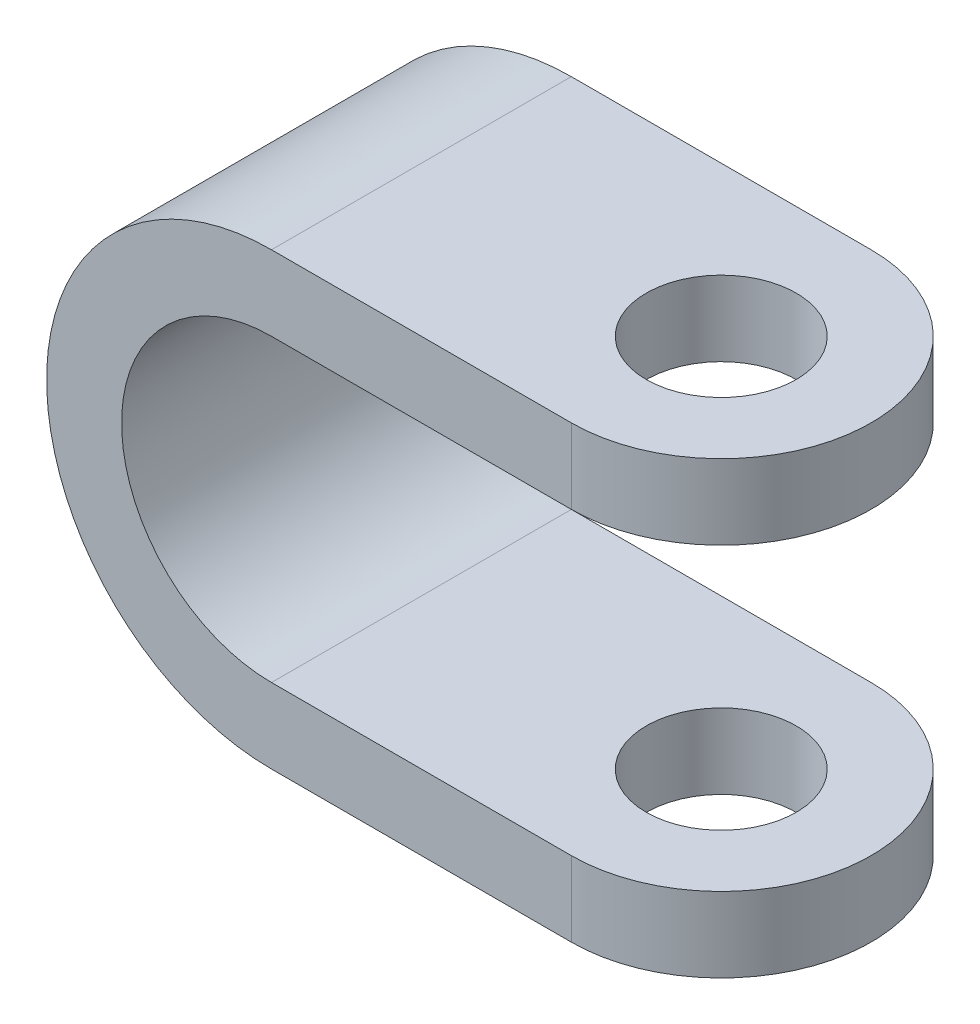
ISO-10303-21;
HEADER;
FILE_DESCRIPTION(('STEP AP214'),'2;1');
FILE_NAME('part.step','',(''),(''),'','','');
FILE_SCHEMA(('AUTOMOTIVE_DESIGN { 1 0 10303 214 1 1 1 1 }'));
ENDSEC;
DATA;
#1=APPLICATION_CONTEXT('core data for automotive mechanical design processes');
#2=APPLICATION_PROTOCOL_DEFINITION('international standard','automotive_design',2000,#1);
#3=PRODUCT_CONTEXT('',#1,'mechanical');
#4=PRODUCT('Part','Part','',(#3));
#5=PRODUCT_RELATED_PRODUCT_CATEGORY('part','',(#4));
#6=PRODUCT_DEFINITION_FORMATION('','',#4);
#7=PRODUCT_DEFINITION_CONTEXT('part definition',#1,'design');
#8=PRODUCT_DEFINITION('design','',#6,#7);
#9=PRODUCT_DEFINITION_SHAPE('','',#8);
#10=(LENGTH_UNIT() NAMED_UNIT(*) SI_UNIT(.MILLI.,.METRE.));
#11=(NAMED_UNIT(*) PLANE_ANGLE_UNIT() SI_UNIT($,.RADIAN.));
#12=(NAMED_UNIT(*) SI_UNIT($,.STERADIAN.) SOLID_ANGLE_UNIT());
#13=UNCERTAINTY_MEASURE_WITH_UNIT(LENGTH_MEASURE(1.E-05),#10,'distance_accuracy_value','');
#14=(GEOMETRIC_REPRESENTATION_CONTEXT(3) GLOBAL_UNCERTAINTY_ASSIGNED_CONTEXT((#13)) GLOBAL_UNIT_ASSIGNED_CONTEXT((#10,
#11,#12)) REPRESENTATION_CONTEXT('',''));
#15=CARTESIAN_POINT('',(0.,0.,0.));
#16=DIRECTION('',(0.,0.,1.));
#17=DIRECTION('',(1.,0.,0.));
#18=AXIS2_PLACEMENT_3D('',#15,#16,#17);
#19=CARTESIAN_POINT('',(-90.,-90.,65.));
#20=DIRECTION('',(0.,0.,1.));
#21=DIRECTION('',(1.,0.,0.));
#22=AXIS2_PLACEMENT_3D('',#19,#20,#21);
#23=PLANE('',#22);
#24=DIRECTION('',(1.,0.,0.));
#25=VECTOR('',#24,1.);
#26=CARTESIAN_POINT('',(-60.,-55.,65.));
#27=LINE('',#26,#25);
#28=CARTESIAN_POINT('',(-60.,-55.,65.));
#29=VERTEX_POINT('',#28);
#30=CARTESIAN_POINT('',(-20.,-55.,65.));
#31=VERTEX_POINT('',#30);
#32=EDGE_CURVE('E120',#29,#31,#27,.T.);
#33=ORIENTED_EDGE('',*,*,#32,.F.);
#34=CARTESIAN_POINT('',(-60.,-35.,65.));
#35=DIRECTION('',(0.,0.,1.));
#36=DIRECTION('',(1.,0.,0.));
#37=AXIS2_PLACEMENT_3D('',#34,#35,#36);
#38=CIRCLE('',#37,20.);
#39=CARTESIAN_POINT('',(-60.,-15.,65.));
#40=VERTEX_POINT('',#39);
#41=EDGE_CURVE('E133',#40,#29,#38,.T.);
#42=ORIENTED_EDGE('',*,*,#41,.F.);
#43=DIRECTION('',(-1.,0.,0.));
#44=VECTOR('',#43,1.);
#45=CARTESIAN_POINT('',(0.,-15.,65.));
#46=LINE('',#45,#44);
#47=CARTESIAN_POINT('',(-20.,-15.,65.));
#48=VERTEX_POINT('',#47);
#49=EDGE_CURVE('E140',#48,#40,#46,.T.);
#50=ORIENTED_EDGE('',*,*,#49,.F.);
#51=DIRECTION('',(0.,1.,0.));
#52=VECTOR('',#51,1.);
#53=CARTESIAN_POINT('',(-20.,-90.,65.));
#54=LINE('',#53,#52);
#55=CARTESIAN_POINT('',(-20.,-5.,65.));
#56=VERTEX_POINT('',#55);
#57=EDGE_CURVE('E125',#48,#56,#54,.T.);
#58=ORIENTED_EDGE('',*,*,#57,.T.);
#59=DIRECTION('',(-1.,0.,0.));
#60=VECTOR('',#59,1.);
#61=CARTESIAN_POINT('',(0.,-5.,65.));
#62=LINE('',#61,#60);
#63=CARTESIAN_POINT('',(-60.,-5.,65.));
#64=VERTEX_POINT('',#63);
#65=EDGE_CURVE('E243',#56,#64,#62,.T.);
#66=ORIENTED_EDGE('',*,*,#65,.T.);
#67=CARTESIAN_POINT('',(-60.,-35.,65.));
#68=DIRECTION('',(0.,0.,1.));
#69=DIRECTION('',(1.,0.,0.));
#70=AXIS2_PLACEMENT_3D('',#67,#68,#69);
#71=CIRCLE('',#70,30.);
#72=CARTESIAN_POINT('',(-60.,-65.,65.));
#73=VERTEX_POINT('',#72);
#74=EDGE_CURVE('E184',#64,#73,#71,.T.);
#75=ORIENTED_EDGE('',*,*,#74,.T.);
#76=DIRECTION('',(1.,0.,0.));
#77=VECTOR('',#76,1.);
#78=CARTESIAN_POINT('',(-60.,-65.,65.));
#79=LINE('',#78,#77);
#80=CARTESIAN_POINT('',(-20.,-65.,65.));
#81=VERTEX_POINT('',#80);
#82=EDGE_CURVE('E122',#73,#81,#79,.T.);
#83=ORIENTED_EDGE('',*,*,#82,.T.);
#84=EDGE_CURVE('E109',#81,#31,#54,.T.);
#85=ORIENTED_EDGE('',*,*,#84,.T.);
#86=EDGE_LOOP('',(#33,#42,#50,#58,#66,#75,#83,#85));
#87=FACE_BOUND('',#86,.T.);
#88=ADVANCED_FACE('F41',(#87),#23,.T.);
#89=CARTESIAN_POINT('',(-90.,-90.,25.));
#90=DIRECTION('',(0.,0.,-1.));
#91=DIRECTION('',(-1.,0.,0.));
#92=AXIS2_PLACEMENT_3D('',#89,#90,#91);
#93=PLANE('',#92);
#94=DIRECTION('',(-1.,0.,0.));
#95=VECTOR('',#94,1.);
#96=CARTESIAN_POINT('',(-60.,-55.,25.));
#97=LINE('',#96,#95);
#98=CARTESIAN_POINT('',(-20.,-55.,25.));
#99=VERTEX_POINT('',#98);
#100=CARTESIAN_POINT('',(-60.,-55.,25.));
#101=VERTEX_POINT('',#100);
#102=EDGE_CURVE('E155',#99,#101,#97,.T.);
#103=ORIENTED_EDGE('',*,*,#102,.F.);
#104=DIRECTION('',(0.,1.,0.));
#105=VECTOR('',#104,1.);
#106=CARTESIAN_POINT('',(-20.,-90.,25.));
#107=LINE('',#106,#105);
#108=CARTESIAN_POINT('',(-20.,-65.,25.));
#109=VERTEX_POINT('',#108);
#110=EDGE_CURVE('E111',#109,#99,#107,.T.);
#111=ORIENTED_EDGE('',*,*,#110,.F.);
#112=DIRECTION('',(-1.,0.,0.));
#113=VECTOR('',#112,1.);
#114=CARTESIAN_POINT('',(-60.,-65.,25.));
#115=LINE('',#114,#113);
#116=CARTESIAN_POINT('',(-60.,-65.,25.));
#117=VERTEX_POINT('',#116);
#118=EDGE_CURVE('E138',#109,#117,#115,.T.);
#119=ORIENTED_EDGE('',*,*,#118,.T.);
#120=CARTESIAN_POINT('',(-60.,-35.,25.));
#121=DIRECTION('',(0.,0.,-1.));
#122=DIRECTION('',(-1.,0.,0.));
#123=AXIS2_PLACEMENT_3D('',#120,#121,#122);
#124=CIRCLE('',#123,30.);
#125=CARTESIAN_POINT('',(-60.,-5.,25.));
#126=VERTEX_POINT('',#125);
#127=EDGE_CURVE('E187',#117,#126,#124,.T.);
#128=ORIENTED_EDGE('',*,*,#127,.T.);
#129=DIRECTION('',(1.,0.,0.));
#130=VECTOR('',#129,1.);
#131=CARTESIAN_POINT('',(0.,-5.,25.));
#132=LINE('',#131,#130);
#133=CARTESIAN_POINT('',(-20.,-5.00000000000002,25.));
#134=VERTEX_POINT('',#133);
#135=EDGE_CURVE('E132',#126,#134,#132,.T.);
#136=ORIENTED_EDGE('',*,*,#135,.T.);
#137=CARTESIAN_POINT('',(-20.,-15.,25.));
#138=VERTEX_POINT('',#137);
#139=EDGE_CURVE('E124',#138,#134,#107,.T.);
#140=ORIENTED_EDGE('',*,*,#139,.F.);
#141=DIRECTION('',(1.,0.,0.));
#142=VECTOR('',#141,1.);
#143=CARTESIAN_POINT('',(0.,-15.,25.));
#144=LINE('',#143,#142);
#145=CARTESIAN_POINT('',(-60.,-15.,25.));
#146=VERTEX_POINT('',#145);
#147=EDGE_CURVE('E147',#146,#138,#144,.T.);
#148=ORIENTED_EDGE('',*,*,#147,.F.);
#149=CARTESIAN_POINT('',(-60.,-35.,25.));
#150=DIRECTION('',(0.,0.,-1.));
#151=DIRECTION('',(-1.,0.,0.));
#152=AXIS2_PLACEMENT_3D('',#149,#150,#151);
#153=CIRCLE('',#152,20.);
#154=EDGE_CURVE('E151',#101,#146,#153,.T.);
#155=ORIENTED_EDGE('',*,*,#154,.F.);
#156=EDGE_LOOP('',(#103,#111,#119,#128,#136,#140,#148,#155));
#157=FACE_BOUND('',#156,.T.);
#158=ADVANCED_FACE('F213',(#157),#93,.T.);
#159=CARTESIAN_POINT('',(-20.,-90.,45.));
#160=DIRECTION('',(0.,1.,0.));
#161=DIRECTION('',(0.,0.,1.));
#162=AXIS2_PLACEMENT_3D('',#159,#160,#161);
#163=CYLINDRICAL_SURFACE('',#162,20.);
#164=CARTESIAN_POINT('',(-20.,-15.,45.));
#165=DIRECTION('',(0.,-1.,0.));
#166=DIRECTION('',(1.,0.,0.));
#167=AXIS2_PLACEMENT_3D('',#164,#165,#166);
#168=CIRCLE('',#167,20.);
#169=EDGE_CURVE('E117',#138,#48,#168,.T.);
#170=ORIENTED_EDGE('',*,*,#169,.F.);
#171=ORIENTED_EDGE('',*,*,#139,.T.);
#172=CARTESIAN_POINT('',(-20.,-5.00000000000002,45.));
#173=DIRECTION('',(0.,-1.,0.));
#174=DIRECTION('',(1.,0.,0.));
#175=AXIS2_PLACEMENT_3D('',#172,#173,#174);
#176=CIRCLE('',#175,20.);
#177=EDGE_CURVE('E45',#134,#56,#176,.T.);
#178=ORIENTED_EDGE('',*,*,#177,.T.);
#179=ORIENTED_EDGE('',*,*,#57,.F.);
#180=EDGE_LOOP('',(#170,#171,#178,#179));
#181=FACE_BOUND('',#180,.T.);
#182=ADVANCED_FACE('F218',(#181),#163,.T.);
#183=ORIENTED_EDGE('',*,*,#84,.F.);
#184=CARTESIAN_POINT('',(-20.,-65.,45.));
#185=DIRECTION('',(0.,1.,0.));
#186=DIRECTION('',(0.,0.,1.));
#187=AXIS2_PLACEMENT_3D('',#184,#185,#186);
#188=CIRCLE('',#187,20.);
#189=EDGE_CURVE('E59',#81,#109,#188,.T.);
#190=ORIENTED_EDGE('',*,*,#189,.T.);
#191=ORIENTED_EDGE('',*,*,#110,.T.);
#192=CARTESIAN_POINT('',(-20.,-55.,45.));
#193=DIRECTION('',(0.,1.,0.));
#194=DIRECTION('',(0.,0.,1.));
#195=AXIS2_PLACEMENT_3D('',#192,#193,#194);
#196=CIRCLE('',#195,20.);
#197=EDGE_CURVE('E106',#31,#99,#196,.T.);
#198=ORIENTED_EDGE('',*,*,#197,.F.);
#199=EDGE_LOOP('',(#183,#190,#191,#198));
#200=FACE_BOUND('',#199,.T.);
#201=ADVANCED_FACE('F108',(#200),#163,.T.);
#202=CARTESIAN_POINT('',(-60.,-35.,90.));
#203=DIRECTION('',(0.,0.,-1.));
#204=DIRECTION('',(-1.,0.,0.));
#205=AXIS2_PLACEMENT_3D('',#202,#203,#204);
#206=CYLINDRICAL_SURFACE('',#205,30.);
#207=DIRECTION('',(0.,0.,-1.));
#208=VECTOR('',#207,1.);
#209=CARTESIAN_POINT('',(-60.,-65.,90.));
#210=LINE('',#209,#208);
#211=EDGE_CURVE('E170',#73,#117,#210,.T.);
#212=ORIENTED_EDGE('',*,*,#211,.F.);
#213=ORIENTED_EDGE('',*,*,#74,.F.);
#214=DIRECTION('',(0.,0.,-1.));
#215=VECTOR('',#214,1.);
#216=CARTESIAN_POINT('',(-60.,-5.,90.));
#217=LINE('',#216,#215);
#218=EDGE_CURVE('E174',#64,#126,#217,.T.);
#219=ORIENTED_EDGE('',*,*,#218,.T.);
#220=ORIENTED_EDGE('',*,*,#127,.F.);
#221=EDGE_LOOP('',(#212,#213,#219,#220));
#222=FACE_BOUND('',#221,.T.);
#223=ADVANCED_FACE('F222',(#222),#206,.T.);
#224=CARTESIAN_POINT('',(0.,-5.,90.));
#225=DIRECTION('',(0.,-1.,0.));
#226=DIRECTION('',(1.,0.,0.));
#227=AXIS2_PLACEMENT_3D('',#224,#225,#226);
#228=PLANE('',#227);
#229=CARTESIAN_POINT('',(-20.,-5.00000000000002,45.));
#230=DIRECTION('',(0.,-1.,0.));
#231=DIRECTION('',(1.,0.,0.));
#232=AXIS2_PLACEMENT_3D('',#229,#230,#231);
#233=CIRCLE('',#232,10.);
#234=CARTESIAN_POINT('',(-20.,-5.00000000000002,55.));
#235=VERTEX_POINT('',#234);
#236=EDGE_CURVE('E158',#235,#235,#233,.T.);
#237=ORIENTED_EDGE('',*,*,#236,.T.);
#238=EDGE_LOOP('',(#237));
#239=FACE_BOUND('',#238,.T.);
#240=ORIENTED_EDGE('',*,*,#135,.F.);
#241=ORIENTED_EDGE('',*,*,#218,.F.);
#242=ORIENTED_EDGE('',*,*,#65,.F.);
#243=ORIENTED_EDGE('',*,*,#177,.F.);
#244=EDGE_LOOP('',(#240,#241,#242,#243));
#245=FACE_BOUND('',#244,.T.);
#246=ADVANCED_FACE('F193',(#239,#245),#228,.F.);
#247=CARTESIAN_POINT('',(-60.,-65.,90.));
#248=DIRECTION('',(0.,1.,0.));
#249=DIRECTION('',(0.,0.,1.));
#250=AXIS2_PLACEMENT_3D('',#247,#248,#249);
#251=PLANE('',#250);
#252=CARTESIAN_POINT('',(-20.,-65.,45.));
#253=DIRECTION('',(0.,1.,0.));
#254=DIRECTION('',(0.,0.,1.));
#255=AXIS2_PLACEMENT_3D('',#252,#253,#254);
#256=CIRCLE('',#255,10.);
#257=CARTESIAN_POINT('',(-20.,-65.,55.));
#258=VERTEX_POINT('',#257);
#259=EDGE_CURVE('E162',#258,#258,#256,.T.);
#260=ORIENTED_EDGE('',*,*,#259,.T.);
#261=EDGE_LOOP('',(#260));
#262=FACE_BOUND('',#261,.T.);
#263=ORIENTED_EDGE('',*,*,#118,.F.);
#264=ORIENTED_EDGE('',*,*,#189,.F.);
#265=ORIENTED_EDGE('',*,*,#82,.F.);
#266=ORIENTED_EDGE('',*,*,#211,.T.);
#267=EDGE_LOOP('',(#263,#264,#265,#266));
#268=FACE_BOUND('',#267,.T.);
#269=ADVANCED_FACE('F43',(#262,#268),#251,.F.);
#270=CARTESIAN_POINT('',(-20.,-90.,45.));
#271=DIRECTION('',(0.,1.,0.));
#272=DIRECTION('',(0.,0.,1.));
#273=AXIS2_PLACEMENT_3D('',#270,#271,#272);
#274=CYLINDRICAL_SURFACE('',#273,10.);
#275=CARTESIAN_POINT('',(-20.,-15.,45.));
#276=DIRECTION('',(0.,-1.,0.));
#277=DIRECTION('',(1.,0.,0.));
#278=AXIS2_PLACEMENT_3D('',#275,#276,#277);
#279=CIRCLE('',#278,10.);
#280=CARTESIAN_POINT('',(-20.,-15.,55.));
#281=VERTEX_POINT('',#280);
#282=EDGE_CURVE('E51',#281,#281,#279,.T.);
#283=CARTESIAN_POINT('',(-20.,-15.,55.));
#284=CARTESIAN_POINT('',(-20.,-14.8958333333333,55.));
#285=CARTESIAN_POINT('',(-20.,-14.7916666666667,55.));
#286=CARTESIAN_POINT('',(-20.,-14.5833333333333,55.));
#287=CARTESIAN_POINT('',(-20.,-14.4791666666667,55.));
#288=CARTESIAN_POINT('',(-20.,-14.2708333333333,55.));
#289=CARTESIAN_POINT('',(-20.,-14.1666666666667,55.));
#290=CARTESIAN_POINT('',(-20.,-13.9583333333333,55.));
#291=CARTESIAN_POINT('',(-20.,-13.8541666666667,55.));
#292=CARTESIAN_POINT('',(-20.,-13.6458333333333,55.));
#293=CARTESIAN_POINT('',(-20.,-13.5416666666667,55.));
#294=CARTESIAN_POINT('',(-20.,-13.3333333333333,55.));
#295=CARTESIAN_POINT('',(-20.,-13.2291666666667,55.));
#296=CARTESIAN_POINT('',(-20.,-13.0208333333333,55.));
#297=CARTESIAN_POINT('',(-20.,-12.9166666666667,55.));
#298=CARTESIAN_POINT('',(-20.,-12.7083333333333,55.));
#299=CARTESIAN_POINT('',(-20.,-12.6041666666667,55.));
#300=CARTESIAN_POINT('',(-20.,-12.3958333333333,55.));
#301=CARTESIAN_POINT('',(-20.,-12.2916666666667,55.));
#302=CARTESIAN_POINT('',(-20.,-12.0833333333333,55.));
#303=CARTESIAN_POINT('',(-20.,-11.9791666666667,55.));
#304=CARTESIAN_POINT('',(-20.,-11.7708333333333,55.));
#305=CARTESIAN_POINT('',(-20.,-11.6666666666667,55.));
#306=CARTESIAN_POINT('',(-20.,-11.4583333333333,55.));
#307=CARTESIAN_POINT('',(-20.,-11.3541666666667,55.));
#308=CARTESIAN_POINT('',(-20.,-11.1458333333333,55.));
#309=CARTESIAN_POINT('',(-20.,-11.0416666666667,55.));
#310=CARTESIAN_POINT('',(-20.,-10.8333333333333,55.));
#311=CARTESIAN_POINT('',(-20.,-10.7291666666667,55.));
#312=CARTESIAN_POINT('',(-20.,-10.5208333333333,55.));
#313=CARTESIAN_POINT('',(-20.,-10.4166666666667,55.));
#314=CARTESIAN_POINT('',(-20.,-10.2083333333333,55.));
#315=CARTESIAN_POINT('',(-20.,-10.1041666666667,55.));
#316=CARTESIAN_POINT('',(-20.,-9.89583333333334,55.));
#317=CARTESIAN_POINT('',(-20.,-9.79166666666668,55.));
#318=CARTESIAN_POINT('',(-20.,-9.58333333333335,55.));
#319=CARTESIAN_POINT('',(-20.,-9.47916666666668,55.));
#320=CARTESIAN_POINT('',(-20.,-9.27083333333334,55.));
#321=CARTESIAN_POINT('',(-20.,-9.16666666666668,55.));
#322=CARTESIAN_POINT('',(-20.,-8.95833333333335,55.));
#323=CARTESIAN_POINT('',(-20.,-8.85416666666668,55.));
#324=CARTESIAN_POINT('',(-20.,-8.64583333333334,55.));
#325=CARTESIAN_POINT('',(-20.,-8.54166666666668,55.));
#326=CARTESIAN_POINT('',(-20.,-8.33333333333334,55.));
#327=CARTESIAN_POINT('',(-20.,-8.22916666666668,55.));
#328=CARTESIAN_POINT('',(-20.,-8.02083333333334,55.));
#329=CARTESIAN_POINT('',(-20.,-7.91666666666668,55.));
#330=CARTESIAN_POINT('',(-20.,-7.70833333333335,55.));
#331=CARTESIAN_POINT('',(-20.,-7.60416666666669,55.));
#332=CARTESIAN_POINT('',(-20.,-7.39583333333335,55.));
#333=CARTESIAN_POINT('',(-20.,-7.29166666666668,55.));
#334=CARTESIAN_POINT('',(-20.,-7.08333333333335,55.));
#335=CARTESIAN_POINT('',(-20.,-6.97916666666668,55.));
#336=CARTESIAN_POINT('',(-20.,-6.77083333333335,55.));
#337=CARTESIAN_POINT('',(-20.,-6.66666666666668,55.));
#338=CARTESIAN_POINT('',(-20.,-6.45833333333335,55.));
#339=CARTESIAN_POINT('',(-20.,-6.35416666666668,55.));
#340=CARTESIAN_POINT('',(-20.,-6.14583333333335,55.));
#341=CARTESIAN_POINT('',(-20.,-6.04166666666668,55.));
#342=CARTESIAN_POINT('',(-20.,-5.83333333333335,55.));
#343=CARTESIAN_POINT('',(-20.,-5.72916666666668,55.));
#344=CARTESIAN_POINT('',(-20.,-5.52083333333335,55.));
#345=CARTESIAN_POINT('',(-20.,-5.41666666666668,55.));
#346=CARTESIAN_POINT('',(-20.,-5.20833333333335,55.));
#347=CARTESIAN_POINT('',(-20.,-5.10416666666668,55.));
#348=CARTESIAN_POINT('',(-20.,-5.00000000000002,55.));
#349=B_SPLINE_CURVE_WITH_KNOTS('',3,(#283,#284,#285,#286,#287,#288,#289,#290,#291,#292,#293,
#294,#295,#296,#297,#298,#299,#300,#301,#302,#303,#304,#305,#306,#307,#308,#309,#310,#311,#312,
#313,#314,#315,#316,#317,#318,#319,#320,#321,#322,#323,#324,#325,#326,#327,#328,#329,#330,#331,
#332,#333,#334,#335,#336,#337,#338,#339,#340,#341,#342,#343,#344,#345,#346,#347,#348),
.UNSPECIFIED.,.F.,.F.,(4,2,2,2,2,2,2,2,2,2,2,2,2,2,2,2,2,2,2,2,2,2,2,2,2,2,2,2,2,2,2,2,4),(0.,
0.312499999999993,0.625000000000001,0.937499999999994,1.25,1.56249999999999,1.875,2.1875,2.5,
2.8125,3.12499999999999,3.4375,3.74999999999999,4.0625,4.37499999999999,4.6875,4.99999999999999,
5.31249999999998,5.62499999999999,5.93749999999998,6.24999999999999,6.56249999999998,
6.87499999999999,7.18749999999999,7.49999999999998,7.81249999999999,8.12499999999998,
8.43749999999999,8.74999999999998,9.06249999999999,9.37499999999998,9.68749999999999,
9.99999999999998),.UNSPECIFIED.);
#350=EDGE_CURVE('BSEAM196',#281,#235,#349,.T.);
#351=ORIENTED_EDGE('',*,*,#282,.T.);
#352=ORIENTED_EDGE('',*,*,#236,.F.);
#353=ORIENTED_EDGE('',*,*,#350,.T.);
#354=ORIENTED_EDGE('',*,*,#350,.F.);
#355=EDGE_LOOP('',(#351,#353,#352,#354));
#356=FACE_BOUND('',#355,.T.);
#357=ADVANCED_FACE('F196',(#356),#274,.F.);
#358=CARTESIAN_POINT('',(-60.,-55.,90.));
#359=DIRECTION('',(0.,1.,0.));
#360=DIRECTION('',(0.,0.,1.));
#361=AXIS2_PLACEMENT_3D('',#358,#359,#360);
#362=PLANE('',#361);
#363=CARTESIAN_POINT('',(-20.,-55.,45.));
#364=DIRECTION('',(0.,1.,0.));
#365=DIRECTION('',(0.,0.,1.));
#366=AXIS2_PLACEMENT_3D('',#363,#364,#365);
#367=CIRCLE('',#366,10.);
#368=CARTESIAN_POINT('',(-20.,-55.,55.));
#369=VERTEX_POINT('',#368);
#370=EDGE_CURVE('E11',#369,#369,#367,.T.);
#371=ORIENTED_EDGE('',*,*,#370,.F.);
#372=EDGE_LOOP('',(#371));
#373=FACE_BOUND('',#372,.T.);
#374=ORIENTED_EDGE('',*,*,#197,.T.);
#375=ORIENTED_EDGE('',*,*,#102,.T.);
#376=DIRECTION('',(0.,0.,-1.));
#377=VECTOR('',#376,1.);
#378=CARTESIAN_POINT('',(-60.,-55.,90.));
#379=LINE('',#378,#377);
#380=EDGE_CURVE('E130',#29,#101,#379,.T.);
#381=ORIENTED_EDGE('',*,*,#380,.F.);
#382=ORIENTED_EDGE('',*,*,#32,.T.);
#383=EDGE_LOOP('',(#374,#375,#381,#382));
#384=FACE_BOUND('',#383,.T.);
#385=ADVANCED_FACE('F128',(#373,#384),#362,.T.);
#386=CARTESIAN_POINT('',(0.,-15.,90.));
#387=DIRECTION('',(0.,-1.,0.));
#388=DIRECTION('',(1.,0.,0.));
#389=AXIS2_PLACEMENT_3D('',#386,#387,#388);
#390=PLANE('',#389);
#391=ORIENTED_EDGE('',*,*,#282,.F.);
#392=EDGE_LOOP('',(#391));
#393=FACE_BOUND('',#392,.T.);
#394=DIRECTION('',(0.,0.,-1.));
#395=VECTOR('',#394,1.);
#396=CARTESIAN_POINT('',(-60.,-15.,90.));
#397=LINE('',#396,#395);
#398=EDGE_CURVE('E178',#40,#146,#397,.T.);
#399=ORIENTED_EDGE('',*,*,#398,.T.);
#400=ORIENTED_EDGE('',*,*,#147,.T.);
#401=ORIENTED_EDGE('',*,*,#169,.T.);
#402=ORIENTED_EDGE('',*,*,#49,.T.);
#403=EDGE_LOOP('',(#399,#400,#401,#402));
#404=FACE_BOUND('',#403,.T.);
#405=ADVANCED_FACE('F205',(#393,#404),#390,.T.);
#406=CARTESIAN_POINT('',(-60.,-35.,90.));
#407=DIRECTION('',(0.,0.,-1.));
#408=DIRECTION('',(-1.,0.,0.));
#409=AXIS2_PLACEMENT_3D('',#406,#407,#408);
#410=CYLINDRICAL_SURFACE('',#409,20.);
#411=ORIENTED_EDGE('',*,*,#380,.T.);
#412=ORIENTED_EDGE('',*,*,#154,.T.);
#413=ORIENTED_EDGE('',*,*,#398,.F.);
#414=ORIENTED_EDGE('',*,*,#41,.T.);
#415=EDGE_LOOP('',(#411,#412,#413,#414));
#416=FACE_BOUND('',#415,.T.);
#417=ADVANCED_FACE('F210',(#416),#410,.F.);
#418=CARTESIAN_POINT('',(-20.,-55.,55.));
#419=CARTESIAN_POINT('',(-20.,-55.1041666666667,55.));
#420=CARTESIAN_POINT('',(-20.,-55.2083333333333,55.));
#421=CARTESIAN_POINT('',(-20.,-55.4166666666667,55.));
#422=CARTESIAN_POINT('',(-20.,-55.5208333333333,55.));
#423=CARTESIAN_POINT('',(-20.,-55.7291666666667,55.));
#424=CARTESIAN_POINT('',(-20.,-55.8333333333333,55.));
#425=CARTESIAN_POINT('',(-20.,-56.0416666666667,55.));
#426=CARTESIAN_POINT('',(-20.,-56.1458333333333,55.));
#427=CARTESIAN_POINT('',(-20.,-56.3541666666667,55.));
#428=CARTESIAN_POINT('',(-20.,-56.4583333333333,55.));
#429=CARTESIAN_POINT('',(-20.,-56.6666666666667,55.));
#430=CARTESIAN_POINT('',(-20.,-56.7708333333333,55.));
#431=CARTESIAN_POINT('',(-20.,-56.9791666666667,55.));
#432=CARTESIAN_POINT('',(-20.,-57.0833333333333,55.));
#433=CARTESIAN_POINT('',(-20.,-57.2916666666667,55.));
#434=CARTESIAN_POINT('',(-20.,-57.3958333333333,55.));
#435=CARTESIAN_POINT('',(-20.,-57.6041666666667,55.));
#436=CARTESIAN_POINT('',(-20.,-57.7083333333333,55.));
#437=CARTESIAN_POINT('',(-20.,-57.9166666666667,55.));
#438=CARTESIAN_POINT('',(-20.,-58.0208333333333,55.));
#439=CARTESIAN_POINT('',(-20.,-58.2291666666667,55.));
#440=CARTESIAN_POINT('',(-20.,-58.3333333333333,55.));
#441=CARTESIAN_POINT('',(-20.,-58.5416666666667,55.));
#442=CARTESIAN_POINT('',(-20.,-58.6458333333333,55.));
#443=CARTESIAN_POINT('',(-20.,-58.8541666666667,55.));
#444=CARTESIAN_POINT('',(-20.,-58.9583333333333,55.));
#445=CARTESIAN_POINT('',(-20.,-59.1666666666667,55.));
#446=CARTESIAN_POINT('',(-20.,-59.2708333333333,55.));
#447=CARTESIAN_POINT('',(-20.,-59.4791666666667,55.));
#448=CARTESIAN_POINT('',(-20.,-59.5833333333333,55.));
#449=CARTESIAN_POINT('',(-20.,-59.7916666666667,55.));
#450=CARTESIAN_POINT('',(-20.,-59.8958333333333,55.));
#451=CARTESIAN_POINT('',(-20.,-60.1041666666667,55.));
#452=CARTESIAN_POINT('',(-20.,-60.2083333333333,55.));
#453=CARTESIAN_POINT('',(-20.,-60.4166666666667,55.));
#454=CARTESIAN_POINT('',(-20.,-60.5208333333333,55.));
#455=CARTESIAN_POINT('',(-20.,-60.7291666666667,55.));
#456=CARTESIAN_POINT('',(-20.,-60.8333333333333,55.));
#457=CARTESIAN_POINT('',(-20.,-61.0416666666667,55.));
#458=CARTESIAN_POINT('',(-20.,-61.1458333333333,55.));
#459=CARTESIAN_POINT('',(-20.,-61.3541666666667,55.));
#460=CARTESIAN_POINT('',(-20.,-61.4583333333333,55.));
#461=CARTESIAN_POINT('',(-20.,-61.6666666666667,55.));
#462=CARTESIAN_POINT('',(-20.,-61.7708333333333,55.));
#463=CARTESIAN_POINT('',(-20.,-61.9791666666667,55.));
#464=CARTESIAN_POINT('',(-20.,-62.0833333333333,55.));
#465=CARTESIAN_POINT('',(-20.,-62.2916666666667,55.));
#466=CARTESIAN_POINT('',(-20.,-62.3958333333333,55.));
#467=CARTESIAN_POINT('',(-20.,-62.6041666666667,55.));
#468=CARTESIAN_POINT('',(-20.,-62.7083333333333,55.));
#469=CARTESIAN_POINT('',(-20.,-62.9166666666667,55.));
#470=CARTESIAN_POINT('',(-20.,-63.0208333333333,55.));
#471=CARTESIAN_POINT('',(-20.,-63.2291666666667,55.));
#472=CARTESIAN_POINT('',(-20.,-63.3333333333333,55.));
#473=CARTESIAN_POINT('',(-20.,-63.5416666666667,55.));
#474=CARTESIAN_POINT('',(-20.,-63.6458333333333,55.));
#475=CARTESIAN_POINT('',(-20.,-63.8541666666667,55.));
#476=CARTESIAN_POINT('',(-20.,-63.9583333333333,55.));
#477=CARTESIAN_POINT('',(-20.,-64.1666666666667,55.));
#478=CARTESIAN_POINT('',(-20.,-64.2708333333333,55.));
#479=CARTESIAN_POINT('',(-20.,-64.4791666666667,55.));
#480=CARTESIAN_POINT('',(-20.,-64.5833333333333,55.));
#481=CARTESIAN_POINT('',(-20.,-64.7916666666667,55.));
#482=CARTESIAN_POINT('',(-20.,-64.8958333333333,55.));
#483=CARTESIAN_POINT('',(-20.,-65.,55.));
#484=B_SPLINE_CURVE_WITH_KNOTS('',3,(#418,#419,#420,#421,#422,#423,#424,#425,#426,#427,#428,
#429,#430,#431,#432,#433,#434,#435,#436,#437,#438,#439,#440,#441,#442,#443,#444,#445,#446,#447,
#448,#449,#450,#451,#452,#453,#454,#455,#456,#457,#458,#459,#460,#461,#462,#463,#464,#465,#466,
#467,#468,#469,#470,#471,#472,#473,#474,#475,#476,#477,#478,#479,#480,#481,#482,#483),
.UNSPECIFIED.,.F.,.F.,(4,2,2,2,2,2,2,2,2,2,2,2,2,2,2,2,2,2,2,2,2,2,2,2,2,2,2,2,2,2,2,2,4),(0.,
0.3125,0.625000000000001,0.937500000000001,1.25,1.5625,1.875,2.1875,2.5,2.8125,3.125,3.4375,
3.75,4.0625,4.375,4.6875,5.,5.3125,5.625,5.9375,6.25,6.5625,6.875,7.18749999999999,7.5,
7.81249999999999,8.125,8.43749999999999,8.75,9.06249999999999,9.375,9.68749999999999,10.),.UNSPECIFIED.);
#485=EDGE_CURVE('BSEAM200',#369,#258,#484,.T.);
#486=ORIENTED_EDGE('',*,*,#370,.T.);
#487=ORIENTED_EDGE('',*,*,#259,.F.);
#488=ORIENTED_EDGE('',*,*,#485,.T.);
#489=ORIENTED_EDGE('',*,*,#485,.F.);
#490=EDGE_LOOP('',(#486,#488,#487,#489));
#491=FACE_BOUND('',#490,.T.);
#492=ADVANCED_FACE('F200',(#491),#274,.F.);
#493=CLOSED_SHELL('',(#88,#158,#182,#201,#223,#246,#269,#357,#385,#405,#417,#492));
#494=MANIFOLD_SOLID_BREP('B2',#493);
#495=ADVANCED_BREP_SHAPE_REPRESENTATION('',(#18,#494),#14);
#496=SHAPE_DEFINITION_REPRESENTATION(#9,#495);
ENDSEC;
END-ISO-10303-21;
